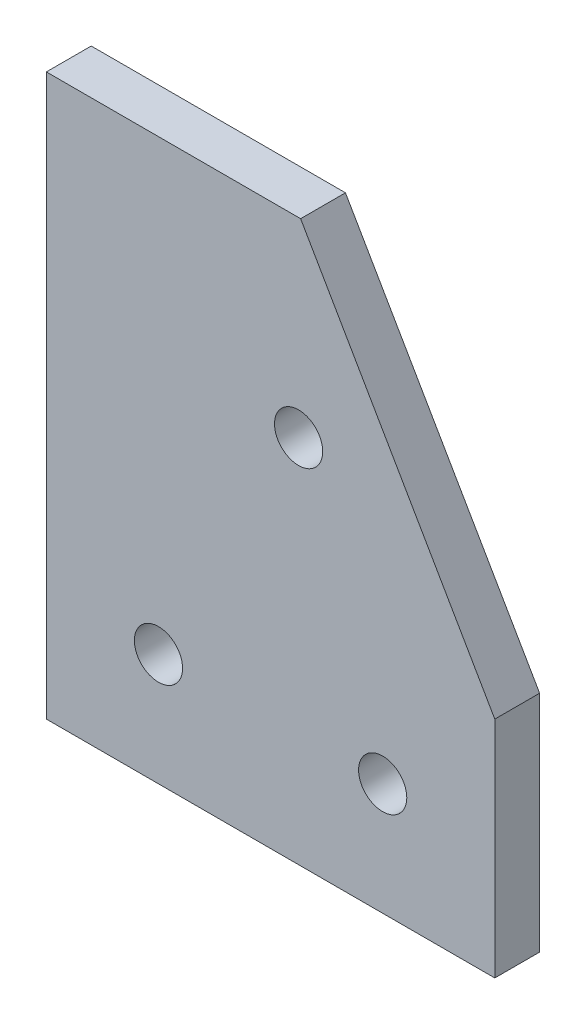
ISO-10303-21;
HEADER;
FILE_DESCRIPTION(('STEP AP214'),'2;1');
FILE_NAME('part.step','',(''),(''),'','','');
FILE_SCHEMA(('AUTOMOTIVE_DESIGN { 1 0 10303 214 1 1 1 1 }'));
ENDSEC;
DATA;
#1=APPLICATION_CONTEXT('core data for automotive mechanical design processes');
#2=APPLICATION_PROTOCOL_DEFINITION('international standard','automotive_design',2000,#1);
#3=PRODUCT_CONTEXT('',#1,'mechanical');
#4=PRODUCT('Part','Part','',(#3));
#5=PRODUCT_RELATED_PRODUCT_CATEGORY('part','',(#4));
#6=PRODUCT_DEFINITION_FORMATION('','',#4);
#7=PRODUCT_DEFINITION_CONTEXT('part definition',#1,'design');
#8=PRODUCT_DEFINITION('design','',#6,#7);
#9=PRODUCT_DEFINITION_SHAPE('','',#8);
#10=(LENGTH_UNIT() NAMED_UNIT(*) SI_UNIT(.MILLI.,.METRE.));
#11=(NAMED_UNIT(*) PLANE_ANGLE_UNIT() SI_UNIT($,.RADIAN.));
#12=(NAMED_UNIT(*) SI_UNIT($,.STERADIAN.) SOLID_ANGLE_UNIT());
#13=UNCERTAINTY_MEASURE_WITH_UNIT(LENGTH_MEASURE(1.E-05),#10,'distance_accuracy_value','');
#14=(GEOMETRIC_REPRESENTATION_CONTEXT(3) GLOBAL_UNCERTAINTY_ASSIGNED_CONTEXT((#13)) GLOBAL_UNIT_ASSIGNED_CONTEXT((#10,
#11,#12)) REPRESENTATION_CONTEXT('',''));
#15=CARTESIAN_POINT('',(0.,0.,0.));
#16=DIRECTION('',(0.,0.,1.));
#17=DIRECTION('',(1.,0.,0.));
#18=AXIS2_PLACEMENT_3D('',#15,#16,#17);
#19=CARTESIAN_POINT('',(20.,25.,4.));
#20=DIRECTION('',(-1.,0.,0.));
#21=DIRECTION('',(0.,-1.,0.));
#22=AXIS2_PLACEMENT_3D('',#19,#20,#21);
#23=PLANE('',#22);
#24=DIRECTION('',(0.,1.,0.));
#25=VECTOR('',#24,1.);
#26=CARTESIAN_POINT('',(20.,25.,0.));
#27=LINE('',#26,#25);
#28=CARTESIAN_POINT('',(20.,-25.,0.));
#29=VERTEX_POINT('',#28);
#30=CARTESIAN_POINT('',(20.,-5.00000000000001,0.));
#31=VERTEX_POINT('',#30);
#32=EDGE_CURVE('E114',#29,#31,#27,.T.);
#33=ORIENTED_EDGE('',*,*,#32,.T.);
#34=DIRECTION('',(0.,0.,1.));
#35=VECTOR('',#34,1.);
#36=CARTESIAN_POINT('',(20.,-5.,0.));
#37=LINE('',#36,#35);
#38=CARTESIAN_POINT('',(20.,-5.,4.));
#39=VERTEX_POINT('',#38);
#40=EDGE_CURVE('E58',#31,#39,#37,.T.);
#41=ORIENTED_EDGE('',*,*,#40,.T.);
#42=DIRECTION('',(0.,1.,0.));
#43=VECTOR('',#42,1.);
#44=CARTESIAN_POINT('',(20.,25.,4.));
#45=LINE('',#44,#43);
#46=CARTESIAN_POINT('',(20.,-25.,4.));
#47=VERTEX_POINT('',#46);
#48=EDGE_CURVE('E121',#47,#39,#45,.T.);
#49=ORIENTED_EDGE('',*,*,#48,.F.);
#50=DIRECTION('',(0.,0.,-1.));
#51=VECTOR('',#50,1.);
#52=CARTESIAN_POINT('',(20.,-25.,4.));
#53=LINE('',#52,#51);
#54=EDGE_CURVE('E122',#47,#29,#53,.T.);
#55=ORIENTED_EDGE('',*,*,#54,.T.);
#56=EDGE_LOOP('',(#33,#41,#49,#55));
#57=FACE_BOUND('',#56,.T.);
#58=ADVANCED_FACE('F44',(#57),#23,.F.);
#59=CARTESIAN_POINT('',(-20.,25.,4.));
#60=DIRECTION('',(0.,-1.,0.));
#61=DIRECTION('',(0.,0.,-1.));
#62=AXIS2_PLACEMENT_3D('',#59,#60,#61);
#63=PLANE('',#62);
#64=DIRECTION('',(-1.,0.,0.));
#65=VECTOR('',#64,1.);
#66=CARTESIAN_POINT('',(-20.,25.,4.));
#67=LINE('',#66,#65);
#68=CARTESIAN_POINT('',(2.68000000000001,25.,4.));
#69=VERTEX_POINT('',#68);
#70=CARTESIAN_POINT('',(-20.,25.,4.));
#71=VERTEX_POINT('',#70);
#72=EDGE_CURVE('E89',#69,#71,#67,.T.);
#73=ORIENTED_EDGE('',*,*,#72,.F.);
#74=DIRECTION('',(0.,0.,1.));
#75=VECTOR('',#74,1.);
#76=CARTESIAN_POINT('',(2.68000000000001,25.,0.));
#77=LINE('',#76,#75);
#78=CARTESIAN_POINT('',(2.68000000000001,25.,0.));
#79=VERTEX_POINT('',#78);
#80=EDGE_CURVE('E100',#79,#69,#77,.T.);
#81=ORIENTED_EDGE('',*,*,#80,.F.);
#82=DIRECTION('',(-1.,0.,0.));
#83=VECTOR('',#82,1.);
#84=CARTESIAN_POINT('',(-20.,25.,0.));
#85=LINE('',#84,#83);
#86=CARTESIAN_POINT('',(-20.,25.,0.));
#87=VERTEX_POINT('',#86);
#88=EDGE_CURVE('E109',#79,#87,#85,.T.);
#89=ORIENTED_EDGE('',*,*,#88,.T.);
#90=DIRECTION('',(0.,0.,-1.));
#91=VECTOR('',#90,1.);
#92=CARTESIAN_POINT('',(-20.,25.,4.));
#93=LINE('',#92,#91);
#94=EDGE_CURVE('E13',#71,#87,#93,.T.);
#95=ORIENTED_EDGE('',*,*,#94,.F.);
#96=EDGE_LOOP('',(#73,#81,#89,#95));
#97=FACE_BOUND('',#96,.T.);
#98=ADVANCED_FACE('F108',(#97),#63,.F.);
#99=CARTESIAN_POINT('',(-20.,25.,4.));
#100=DIRECTION('',(1.,0.,0.));
#101=DIRECTION('',(0.,1.,0.));
#102=AXIS2_PLACEMENT_3D('',#99,#100,#101);
#103=PLANE('',#102);
#104=DIRECTION('',(0.,-1.,0.));
#105=VECTOR('',#104,1.);
#106=CARTESIAN_POINT('',(-20.,25.,0.));
#107=LINE('',#106,#105);
#108=CARTESIAN_POINT('',(-20.,-25.,0.));
#109=VERTEX_POINT('',#108);
#110=EDGE_CURVE('E113',#87,#109,#107,.T.);
#111=ORIENTED_EDGE('',*,*,#110,.T.);
#112=DIRECTION('',(0.,0.,-1.));
#113=VECTOR('',#112,1.);
#114=CARTESIAN_POINT('',(-20.,-25.,4.));
#115=LINE('',#114,#113);
#116=CARTESIAN_POINT('',(-20.,-25.,4.));
#117=VERTEX_POINT('',#116);
#118=EDGE_CURVE('E51',#117,#109,#115,.T.);
#119=ORIENTED_EDGE('',*,*,#118,.F.);
#120=DIRECTION('',(0.,-1.,0.));
#121=VECTOR('',#120,1.);
#122=CARTESIAN_POINT('',(-20.,25.,4.));
#123=LINE('',#122,#121);
#124=EDGE_CURVE('E130',#71,#117,#123,.T.);
#125=ORIENTED_EDGE('',*,*,#124,.F.);
#126=ORIENTED_EDGE('',*,*,#94,.T.);
#127=EDGE_LOOP('',(#111,#119,#125,#126));
#128=FACE_BOUND('',#127,.T.);
#129=ADVANCED_FACE('F135',(#128),#103,.F.);
#130=CARTESIAN_POINT('',(-20.,-25.,4.));
#131=DIRECTION('',(0.,1.,0.));
#132=DIRECTION('',(0.,0.,1.));
#133=AXIS2_PLACEMENT_3D('',#130,#131,#132);
#134=PLANE('',#133);
#135=DIRECTION('',(1.,0.,0.));
#136=VECTOR('',#135,1.);
#137=CARTESIAN_POINT('',(-20.,-25.,0.));
#138=LINE('',#137,#136);
#139=EDGE_CURVE('E84',#109,#29,#138,.T.);
#140=ORIENTED_EDGE('',*,*,#139,.T.);
#141=ORIENTED_EDGE('',*,*,#54,.F.);
#142=DIRECTION('',(1.,0.,0.));
#143=VECTOR('',#142,1.);
#144=CARTESIAN_POINT('',(-20.,-25.,4.));
#145=LINE('',#144,#143);
#146=EDGE_CURVE('E67',#117,#47,#145,.T.);
#147=ORIENTED_EDGE('',*,*,#146,.F.);
#148=ORIENTED_EDGE('',*,*,#118,.T.);
#149=EDGE_LOOP('',(#140,#141,#147,#148));
#150=FACE_BOUND('',#149,.T.);
#151=ADVANCED_FACE('F124',(#150),#134,.F.);
#152=CARTESIAN_POINT('',(0.,0.,4.));
#153=DIRECTION('',(0.,0.,1.));
#154=DIRECTION('',(1.,0.,0.));
#155=AXIS2_PLACEMENT_3D('',#152,#153,#154);
#156=PLANE('',#155);
#157=CARTESIAN_POINT('',(10.,-15.,4.));
#158=DIRECTION('',(0.,0.,1.));
#159=DIRECTION('',(1.,0.,0.));
#160=AXIS2_PLACEMENT_3D('',#157,#158,#159);
#161=CIRCLE('',#160,2.15);
#162=CARTESIAN_POINT('',(12.15,-15.,4.));
#163=VERTEX_POINT('',#162);
#164=EDGE_CURVE('E219',#163,#163,#161,.T.);
#165=ORIENTED_EDGE('',*,*,#164,.F.);
#166=EDGE_LOOP('',(#165));
#167=FACE_BOUND('',#166,.T.);
#168=CARTESIAN_POINT('',(-10.,-15.,4.));
#169=DIRECTION('',(0.,0.,1.));
#170=DIRECTION('',(1.,0.,0.));
#171=AXIS2_PLACEMENT_3D('',#168,#169,#170);
#172=CIRCLE('',#171,2.15);
#173=CARTESIAN_POINT('',(-7.85,-15.,4.));
#174=VERTEX_POINT('',#173);
#175=EDGE_CURVE('E221',#174,#174,#172,.T.);
#176=ORIENTED_EDGE('',*,*,#175,.F.);
#177=EDGE_LOOP('',(#176));
#178=FACE_BOUND('',#177,.T.);
#179=CARTESIAN_POINT('',(2.50016500423513,7.99047632060889,4.));
#180=DIRECTION('',(0.,0.,1.));
#181=DIRECTION('',(1.,0.,0.));
#182=AXIS2_PLACEMENT_3D('',#179,#180,#181);
#183=CIRCLE('',#182,2.15);
#184=CARTESIAN_POINT('',(4.65016500423513,7.99047632060889,4.));
#185=VERTEX_POINT('',#184);
#186=EDGE_CURVE('E227',#185,#185,#183,.T.);
#187=ORIENTED_EDGE('',*,*,#186,.F.);
#188=EDGE_LOOP('',(#187));
#189=FACE_BOUND('',#188,.T.);
#190=DIRECTION('',(0.499988999717658,-0.86603175470726,0.));
#191=VECTOR('',#190,1.);
#192=CARTESIAN_POINT('',(2.68000000000001,25.,4.));
#193=LINE('',#192,#191);
#194=EDGE_CURVE('E105',#69,#39,#193,.T.);
#195=ORIENTED_EDGE('',*,*,#194,.F.);
#196=ORIENTED_EDGE('',*,*,#72,.T.);
#197=ORIENTED_EDGE('',*,*,#124,.T.);
#198=ORIENTED_EDGE('',*,*,#146,.T.);
#199=ORIENTED_EDGE('',*,*,#48,.T.);
#200=EDGE_LOOP('',(#195,#196,#197,#198,#199));
#201=FACE_BOUND('',#200,.T.);
#202=ADVANCED_FACE('F134',(#167,#178,#189,#201),#156,.T.);
#203=CARTESIAN_POINT('',(0.,0.,0.));
#204=DIRECTION('',(0.,0.,1.));
#205=DIRECTION('',(1.,0.,0.));
#206=AXIS2_PLACEMENT_3D('',#203,#204,#205);
#207=PLANE('',#206);
#208=CARTESIAN_POINT('',(10.,-15.,0.));
#209=DIRECTION('',(0.,0.,1.));
#210=DIRECTION('',(1.,0.,0.));
#211=AXIS2_PLACEMENT_3D('',#208,#209,#210);
#212=CIRCLE('',#211,2.15);
#213=CARTESIAN_POINT('',(12.15,-15.,0.));
#214=VERTEX_POINT('',#213);
#215=EDGE_CURVE('E216',#214,#214,#212,.T.);
#216=ORIENTED_EDGE('',*,*,#215,.T.);
#217=EDGE_LOOP('',(#216));
#218=FACE_BOUND('',#217,.T.);
#219=CARTESIAN_POINT('',(-10.,-15.,0.));
#220=DIRECTION('',(0.,0.,1.));
#221=DIRECTION('',(1.,0.,0.));
#222=AXIS2_PLACEMENT_3D('',#219,#220,#221);
#223=CIRCLE('',#222,2.15);
#224=CARTESIAN_POINT('',(-7.85,-15.,0.));
#225=VERTEX_POINT('',#224);
#226=EDGE_CURVE('E224',#225,#225,#223,.T.);
#227=ORIENTED_EDGE('',*,*,#226,.T.);
#228=EDGE_LOOP('',(#227));
#229=FACE_BOUND('',#228,.T.);
#230=CARTESIAN_POINT('',(2.50016500423513,7.99047632060889,0.));
#231=DIRECTION('',(0.,0.,1.));
#232=DIRECTION('',(1.,0.,0.));
#233=AXIS2_PLACEMENT_3D('',#230,#231,#232);
#234=CIRCLE('',#233,2.15);
#235=CARTESIAN_POINT('',(4.65016500423513,7.99047632060889,0.));
#236=VERTEX_POINT('',#235);
#237=EDGE_CURVE('E230',#236,#236,#234,.T.);
#238=ORIENTED_EDGE('',*,*,#237,.T.);
#239=EDGE_LOOP('',(#238));
#240=FACE_BOUND('',#239,.T.);
#241=ORIENTED_EDGE('',*,*,#88,.F.);
#242=DIRECTION('',(0.499988999717658,-0.86603175470726,0.));
#243=VECTOR('',#242,1.);
#244=CARTESIAN_POINT('',(2.68000000000001,25.,0.));
#245=LINE('',#244,#243);
#246=EDGE_CURVE('E97',#79,#31,#245,.T.);
#247=ORIENTED_EDGE('',*,*,#246,.T.);
#248=ORIENTED_EDGE('',*,*,#32,.F.);
#249=ORIENTED_EDGE('',*,*,#139,.F.);
#250=ORIENTED_EDGE('',*,*,#110,.F.);
#251=EDGE_LOOP('',(#241,#247,#248,#249,#250));
#252=FACE_BOUND('',#251,.T.);
#253=ADVANCED_FACE('F112',(#218,#229,#240,#252),#207,.F.);
#254=CARTESIAN_POINT('',(2.68000000000001,25.,0.));
#255=DIRECTION('',(-0.86603175470726,-0.499988999717658,0.));
#256=DIRECTION('',(0.499988999717658,-0.86603175470726,0.));
#257=AXIS2_PLACEMENT_3D('',#254,#255,#256);
#258=PLANE('',#257);
#259=ORIENTED_EDGE('',*,*,#194,.T.);
#260=ORIENTED_EDGE('',*,*,#40,.F.);
#261=ORIENTED_EDGE('',*,*,#246,.F.);
#262=ORIENTED_EDGE('',*,*,#80,.T.);
#263=EDGE_LOOP('',(#259,#260,#261,#262));
#264=FACE_BOUND('',#263,.T.);
#265=ADVANCED_FACE('F99',(#264),#258,.F.);
#266=CARTESIAN_POINT('',(2.50016500423513,7.99047632060889,0.));
#267=DIRECTION('',(0.,0.,1.));
#268=DIRECTION('',(1.,0.,0.));
#269=AXIS2_PLACEMENT_3D('',#266,#267,#268);
#270=CYLINDRICAL_SURFACE('',#269,2.15);
#271=ORIENTED_EDGE('',*,*,#237,.F.);
#272=EDGE_LOOP('',(#271));
#273=FACE_BOUND('',#272,.T.);
#274=ORIENTED_EDGE('',*,*,#186,.T.);
#275=EDGE_LOOP('',(#274));
#276=FACE_BOUND('',#275,.T.);
#277=ADVANCED_FACE('F161',(#273,#276),#270,.F.);
#278=CARTESIAN_POINT('',(-10.,-15.,0.));
#279=DIRECTION('',(0.,0.,1.));
#280=DIRECTION('',(1.,0.,0.));
#281=AXIS2_PLACEMENT_3D('',#278,#279,#280);
#282=CYLINDRICAL_SURFACE('',#281,2.15);
#283=ORIENTED_EDGE('',*,*,#226,.F.);
#284=EDGE_LOOP('',(#283));
#285=FACE_BOUND('',#284,.T.);
#286=ORIENTED_EDGE('',*,*,#175,.T.);
#287=EDGE_LOOP('',(#286));
#288=FACE_BOUND('',#287,.T.);
#289=ADVANCED_FACE('F172',(#285,#288),#282,.F.);
#290=CARTESIAN_POINT('',(10.,-15.,0.));
#291=DIRECTION('',(0.,0.,1.));
#292=DIRECTION('',(1.,0.,0.));
#293=AXIS2_PLACEMENT_3D('',#290,#291,#292);
#294=CYLINDRICAL_SURFACE('',#293,2.15);
#295=ORIENTED_EDGE('',*,*,#215,.F.);
#296=EDGE_LOOP('',(#295));
#297=FACE_BOUND('',#296,.T.);
#298=ORIENTED_EDGE('',*,*,#164,.T.);
#299=EDGE_LOOP('',(#298));
#300=FACE_BOUND('',#299,.T.);
#301=ADVANCED_FACE('F182',(#297,#300),#294,.F.);
#302=CLOSED_SHELL('',(#58,#98,#129,#151,#202,#253,#265,#277,#289,#301));
#303=MANIFOLD_SOLID_BREP('B2',#302);
#304=ADVANCED_BREP_SHAPE_REPRESENTATION('',(#18,#303),#14);
#305=SHAPE_DEFINITION_REPRESENTATION(#9,#304);
ENDSEC;
END-ISO-10303-21;
